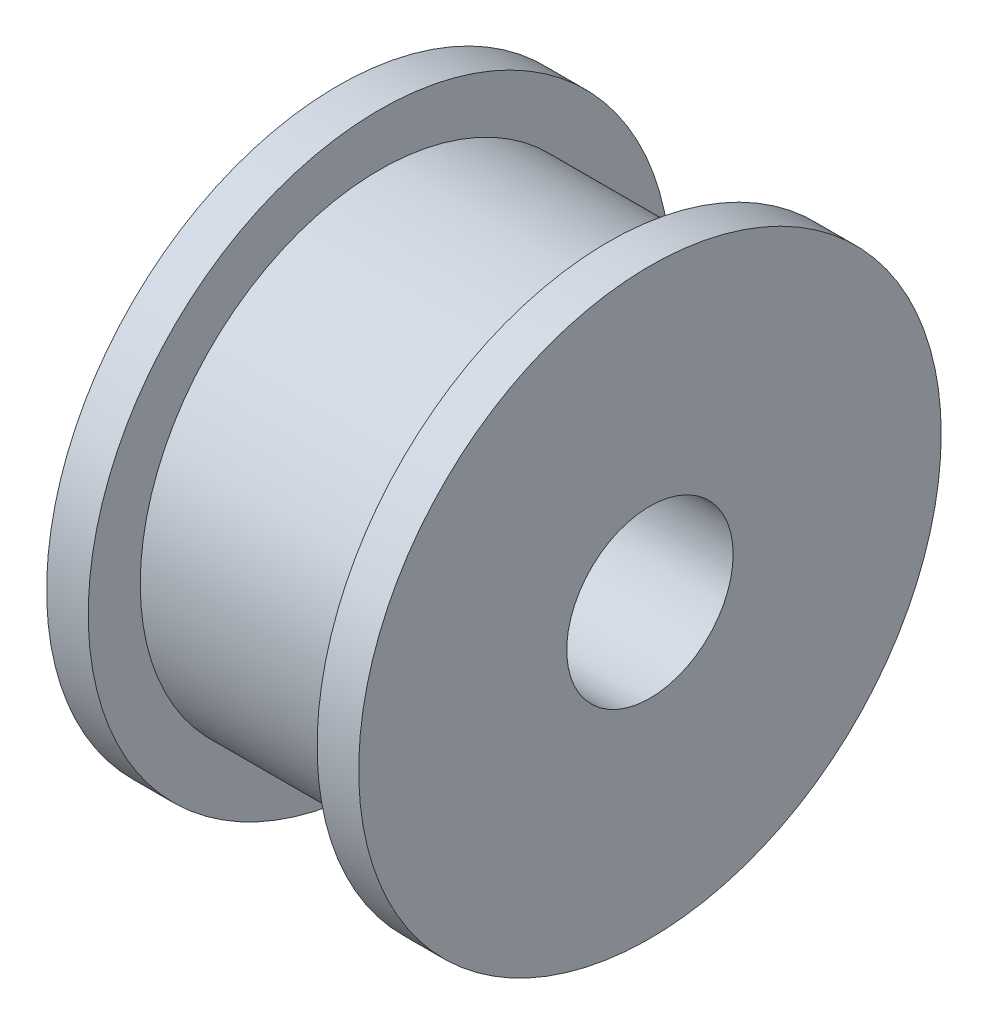
ISO-10303-21;
HEADER;
FILE_DESCRIPTION(('STEP AP214'),'2;1');
FILE_NAME('part.step','',(''),(''),'','','');
FILE_SCHEMA(('AUTOMOTIVE_DESIGN { 1 0 10303 214 1 1 1 1 }'));
ENDSEC;
DATA;
#1=APPLICATION_CONTEXT('core data for automotive mechanical design processes');
#2=APPLICATION_PROTOCOL_DEFINITION('international standard','automotive_design',2000,#1);
#3=PRODUCT_CONTEXT('',#1,'mechanical');
#4=PRODUCT('Part','Part','',(#3));
#5=PRODUCT_RELATED_PRODUCT_CATEGORY('part','',(#4));
#6=PRODUCT_DEFINITION_FORMATION('','',#4);
#7=PRODUCT_DEFINITION_CONTEXT('part definition',#1,'design');
#8=PRODUCT_DEFINITION('design','',#6,#7);
#9=PRODUCT_DEFINITION_SHAPE('','',#8);
#10=(LENGTH_UNIT() NAMED_UNIT(*) SI_UNIT(.MILLI.,.METRE.));
#11=(NAMED_UNIT(*) PLANE_ANGLE_UNIT() SI_UNIT($,.RADIAN.));
#12=(NAMED_UNIT(*) SI_UNIT($,.STERADIAN.) SOLID_ANGLE_UNIT());
#13=UNCERTAINTY_MEASURE_WITH_UNIT(LENGTH_MEASURE(1.E-05),#10,'distance_accuracy_value','');
#14=(GEOMETRIC_REPRESENTATION_CONTEXT(3) GLOBAL_UNCERTAINTY_ASSIGNED_CONTEXT((#13)) GLOBAL_UNIT_ASSIGNED_CONTEXT((#10,
#11,#12)) REPRESENTATION_CONTEXT('',''));
#15=CARTESIAN_POINT('',(0.,0.,0.));
#16=DIRECTION('',(0.,0.,1.));
#17=DIRECTION('',(1.,0.,0.));
#18=AXIS2_PLACEMENT_3D('',#15,#16,#17);
#19=CARTESIAN_POINT('',(7.5,0.,0.));
#20=DIRECTION('',(-1.,0.,0.));
#21=DIRECTION('',(0.,0.,1.));
#22=AXIS2_PLACEMENT_3D('',#19,#20,#21);
#23=CYLINDRICAL_SURFACE('',#22,14.);
#24=CARTESIAN_POINT('',(-7.5,0.,0.));
#25=DIRECTION('',(1.,0.,0.));
#26=DIRECTION('',(0.,0.,-1.));
#27=AXIS2_PLACEMENT_3D('',#24,#25,#26);
#28=CIRCLE('',#27,14.);
#29=CARTESIAN_POINT('',(-7.5,0.,-14.));
#30=VERTEX_POINT('',#29);
#31=EDGE_CURVE('E42',#30,#30,#28,.T.);
#32=ORIENTED_EDGE('',*,*,#31,.T.);
#33=EDGE_LOOP('',(#32));
#34=FACE_BOUND('',#33,.T.);
#35=CARTESIAN_POINT('',(-5.5,0.,0.));
#36=DIRECTION('',(1.,0.,0.));
#37=DIRECTION('',(0.,0.,-1.));
#38=AXIS2_PLACEMENT_3D('',#35,#36,#37);
#39=CIRCLE('',#38,14.);
#40=CARTESIAN_POINT('',(-5.5,0.,-14.));
#41=VERTEX_POINT('',#40);
#42=EDGE_CURVE('E38',#41,#41,#39,.T.);
#43=ORIENTED_EDGE('',*,*,#42,.F.);
#44=EDGE_LOOP('',(#43));
#45=FACE_BOUND('',#44,.T.);
#46=ADVANCED_FACE('F34',(#34,#45),#23,.T.);
#47=CARTESIAN_POINT('',(7.5,0.,0.));
#48=DIRECTION('',(1.,0.,0.));
#49=DIRECTION('',(0.,0.,-1.));
#50=AXIS2_PLACEMENT_3D('',#47,#48,#49);
#51=PLANE('',#50);
#52=CARTESIAN_POINT('',(7.5,0.,0.));
#53=DIRECTION('',(1.,0.,0.));
#54=DIRECTION('',(0.,0.,-1.));
#55=AXIS2_PLACEMENT_3D('',#52,#53,#54);
#56=CIRCLE('',#55,14.);
#57=CARTESIAN_POINT('',(7.5,0.,-14.));
#58=VERTEX_POINT('',#57);
#59=EDGE_CURVE('E11',#58,#58,#56,.T.);
#60=ORIENTED_EDGE('',*,*,#59,.T.);
#61=EDGE_LOOP('',(#60));
#62=FACE_BOUND('',#61,.T.);
#63=CARTESIAN_POINT('',(7.5,0.,0.));
#64=DIRECTION('',(1.,0.,0.));
#65=DIRECTION('',(0.,0.,-1.));
#66=AXIS2_PLACEMENT_3D('',#63,#64,#65);
#67=CIRCLE('',#66,4.);
#68=CARTESIAN_POINT('',(7.5,0.,-4.));
#69=VERTEX_POINT('',#68);
#70=EDGE_CURVE('E47',#69,#69,#67,.T.);
#71=ORIENTED_EDGE('',*,*,#70,.F.);
#72=EDGE_LOOP('',(#71));
#73=FACE_BOUND('',#72,.T.);
#74=ADVANCED_FACE('F87',(#62,#73),#51,.T.);
#75=CARTESIAN_POINT('',(-7.5,0.,0.));
#76=DIRECTION('',(1.,0.,0.));
#77=DIRECTION('',(0.,0.,-1.));
#78=AXIS2_PLACEMENT_3D('',#75,#76,#77);
#79=PLANE('',#78);
#80=ORIENTED_EDGE('',*,*,#31,.F.);
#81=EDGE_LOOP('',(#80));
#82=FACE_BOUND('',#81,.T.);
#83=CARTESIAN_POINT('',(-7.5,0.,0.));
#84=DIRECTION('',(1.,0.,0.));
#85=DIRECTION('',(0.,0.,-1.));
#86=AXIS2_PLACEMENT_3D('',#83,#84,#85);
#87=CIRCLE('',#86,4.);
#88=CARTESIAN_POINT('',(-7.5,0.,-4.));
#89=VERTEX_POINT('',#88);
#90=EDGE_CURVE('E50',#89,#89,#87,.T.);
#91=ORIENTED_EDGE('',*,*,#90,.T.);
#92=EDGE_LOOP('',(#91));
#93=FACE_BOUND('',#92,.T.);
#94=ADVANCED_FACE('F71',(#82,#93),#79,.F.);
#95=CARTESIAN_POINT('',(5.5,0.,0.));
#96=DIRECTION('',(1.,0.,0.));
#97=DIRECTION('',(0.,0.,-1.));
#98=AXIS2_PLACEMENT_3D('',#95,#96,#97);
#99=CIRCLE('',#98,14.);
#100=CARTESIAN_POINT('',(5.5,0.,-14.));
#101=VERTEX_POINT('',#100);
#102=EDGE_CURVE('E52',#101,#101,#99,.T.);
#103=ORIENTED_EDGE('',*,*,#102,.T.);
#104=EDGE_LOOP('',(#103));
#105=FACE_BOUND('',#104,.T.);
#106=ORIENTED_EDGE('',*,*,#59,.F.);
#107=EDGE_LOOP('',(#106));
#108=FACE_BOUND('',#107,.T.);
#109=ADVANCED_FACE('F36',(#105,#108),#23,.T.);
#110=CARTESIAN_POINT('',(7.5,0.,0.));
#111=DIRECTION('',(-1.,0.,0.));
#112=DIRECTION('',(0.,0.,1.));
#113=AXIS2_PLACEMENT_3D('',#110,#111,#112);
#114=CYLINDRICAL_SURFACE('',#113,4.);
#115=ORIENTED_EDGE('',*,*,#70,.T.);
#116=EDGE_LOOP('',(#115));
#117=FACE_BOUND('',#116,.T.);
#118=ORIENTED_EDGE('',*,*,#90,.F.);
#119=EDGE_LOOP('',(#118));
#120=FACE_BOUND('',#119,.T.);
#121=ADVANCED_FACE('F73',(#117,#120),#114,.F.);
#122=CARTESIAN_POINT('',(-5.5,0.,0.));
#123=DIRECTION('',(1.,0.,0.));
#124=DIRECTION('',(0.,0.,-1.));
#125=AXIS2_PLACEMENT_3D('',#122,#123,#124);
#126=PLANE('',#125);
#127=CARTESIAN_POINT('',(-5.5,0.,0.));
#128=DIRECTION('',(1.,0.,0.));
#129=DIRECTION('',(0.,0.,-1.));
#130=AXIS2_PLACEMENT_3D('',#127,#128,#129);
#131=CIRCLE('',#130,11.5);
#132=CARTESIAN_POINT('',(-5.5,0.,-11.5));
#133=VERTEX_POINT('',#132);
#134=EDGE_CURVE('E54',#133,#133,#131,.T.);
#135=ORIENTED_EDGE('',*,*,#134,.F.);
#136=EDGE_LOOP('',(#135));
#137=FACE_BOUND('',#136,.T.);
#138=ORIENTED_EDGE('',*,*,#42,.T.);
#139=EDGE_LOOP('',(#138));
#140=FACE_BOUND('',#139,.T.);
#141=ADVANCED_FACE('F75',(#137,#140),#126,.T.);
#142=CARTESIAN_POINT('',(5.5,0.,0.));
#143=DIRECTION('',(1.,0.,0.));
#144=DIRECTION('',(0.,0.,-1.));
#145=AXIS2_PLACEMENT_3D('',#142,#143,#144);
#146=PLANE('',#145);
#147=CARTESIAN_POINT('',(5.5,0.,0.));
#148=DIRECTION('',(1.,0.,0.));
#149=DIRECTION('',(0.,0.,-1.));
#150=AXIS2_PLACEMENT_3D('',#147,#148,#149);
#151=CIRCLE('',#150,11.5);
#152=CARTESIAN_POINT('',(5.5,0.,-11.5));
#153=VERTEX_POINT('',#152);
#154=EDGE_CURVE('E59',#153,#153,#151,.T.);
#155=ORIENTED_EDGE('',*,*,#154,.T.);
#156=EDGE_LOOP('',(#155));
#157=FACE_BOUND('',#156,.T.);
#158=ORIENTED_EDGE('',*,*,#102,.F.);
#159=EDGE_LOOP('',(#158));
#160=FACE_BOUND('',#159,.T.);
#161=ADVANCED_FACE('F81',(#157,#160),#146,.F.);
#162=CARTESIAN_POINT('',(-5.5,0.,0.));
#163=DIRECTION('',(1.,0.,0.));
#164=DIRECTION('',(0.,0.,-1.));
#165=AXIS2_PLACEMENT_3D('',#162,#163,#164);
#166=CYLINDRICAL_SURFACE('',#165,11.5);
#167=ORIENTED_EDGE('',*,*,#134,.T.);
#168=EDGE_LOOP('',(#167));
#169=FACE_BOUND('',#168,.T.);
#170=ORIENTED_EDGE('',*,*,#154,.F.);
#171=EDGE_LOOP('',(#170));
#172=FACE_BOUND('',#171,.T.);
#173=ADVANCED_FACE('F124',(#169,#172),#166,.T.);
#174=CLOSED_SHELL('',(#46,#74,#94,#109,#121,#141,#161,#173));
#175=MANIFOLD_SOLID_BREP('B2',#174);
#176=ADVANCED_BREP_SHAPE_REPRESENTATION('',(#18,#175),#14);
#177=SHAPE_DEFINITION_REPRESENTATION(#9,#176);
ENDSEC;
END-ISO-10303-21;
